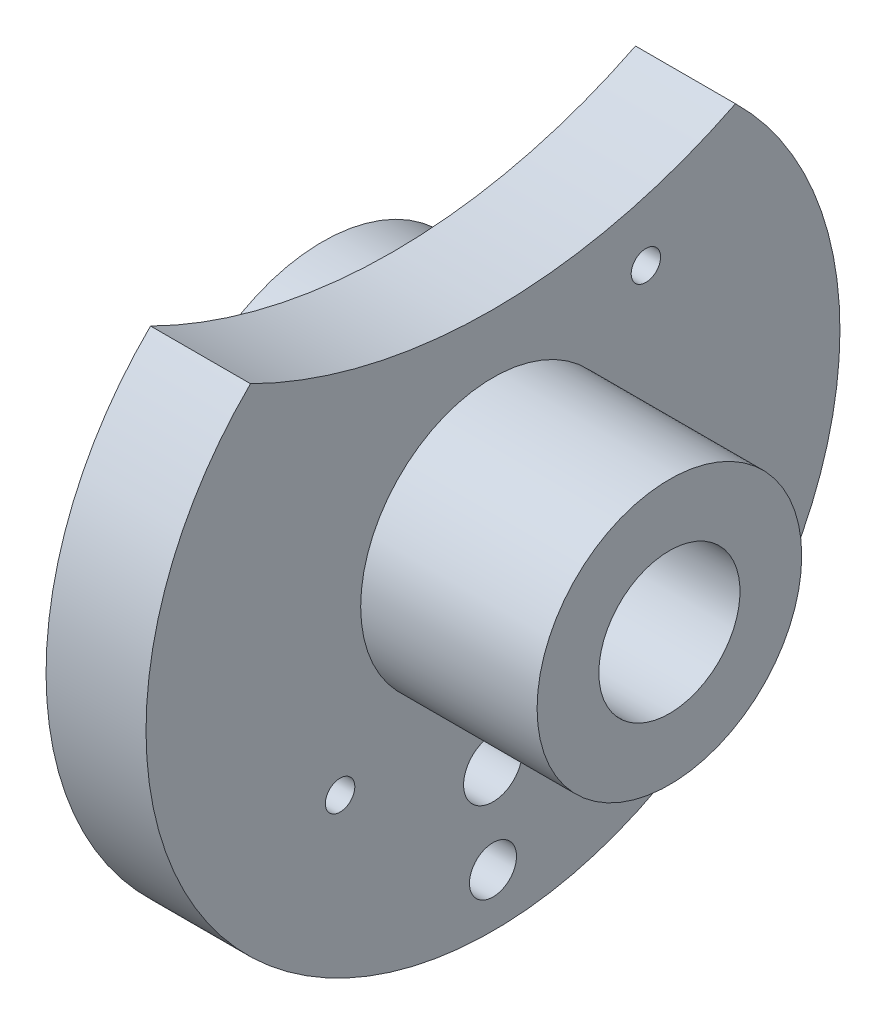
ISO-10303-21;
HEADER;
FILE_DESCRIPTION(('STEP AP214'),'2;1');
FILE_NAME('part.step','',(''),(''),'','','');
FILE_SCHEMA(('AUTOMOTIVE_DESIGN { 1 0 10303 214 1 1 1 1 }'));
ENDSEC;
DATA;
#1=APPLICATION_CONTEXT('core data for automotive mechanical design processes');
#2=APPLICATION_PROTOCOL_DEFINITION('international standard','automotive_design',2000,#1);
#3=PRODUCT_CONTEXT('',#1,'mechanical');
#4=PRODUCT('Part','Part','',(#3));
#5=PRODUCT_RELATED_PRODUCT_CATEGORY('part','',(#4));
#6=PRODUCT_DEFINITION_FORMATION('','',#4);
#7=PRODUCT_DEFINITION_CONTEXT('part definition',#1,'design');
#8=PRODUCT_DEFINITION('design','',#6,#7);
#9=PRODUCT_DEFINITION_SHAPE('','',#8);
#10=(LENGTH_UNIT() NAMED_UNIT(*) SI_UNIT(.MILLI.,.METRE.));
#11=(NAMED_UNIT(*) PLANE_ANGLE_UNIT() SI_UNIT($,.RADIAN.));
#12=(NAMED_UNIT(*) SI_UNIT($,.STERADIAN.) SOLID_ANGLE_UNIT());
#13=UNCERTAINTY_MEASURE_WITH_UNIT(LENGTH_MEASURE(1.E-05),#10,'distance_accuracy_value','');
#14=(GEOMETRIC_REPRESENTATION_CONTEXT(3) GLOBAL_UNCERTAINTY_ASSIGNED_CONTEXT((#13)) GLOBAL_UNIT_ASSIGNED_CONTEXT((#10,
#11,#12)) REPRESENTATION_CONTEXT('',''));
#15=CARTESIAN_POINT('',(0.,0.,0.));
#16=DIRECTION('',(0.,0.,1.));
#17=DIRECTION('',(1.,0.,0.));
#18=AXIS2_PLACEMENT_3D('',#15,#16,#17);
#19=CARTESIAN_POINT('',(-50.,0.,0.));
#20=DIRECTION('',(-1.,0.,0.));
#21=DIRECTION('',(0.,0.,1.));
#22=AXIS2_PLACEMENT_3D('',#19,#20,#21);
#23=CYLINDRICAL_SURFACE('',#22,24.);
#24=CARTESIAN_POINT('',(19.,0.,0.));
#25=DIRECTION('',(-1.,0.,0.));
#26=DIRECTION('',(0.,0.,1.));
#27=AXIS2_PLACEMENT_3D('',#24,#25,#26);
#28=CIRCLE('',#27,24.);
#29=CARTESIAN_POINT('',(19.,0.,24.));
#30=VERTEX_POINT('',#29);
#31=EDGE_CURVE('E64',#30,#30,#28,.T.);
#32=ORIENTED_EDGE('',*,*,#31,.F.);
#33=EDGE_LOOP('',(#32));
#34=FACE_BOUND('',#33,.T.);
#35=CARTESIAN_POINT('',(0.,0.,0.));
#36=DIRECTION('',(-1.,0.,0.));
#37=DIRECTION('',(0.,0.,1.));
#38=AXIS2_PLACEMENT_3D('',#35,#36,#37);
#39=CIRCLE('',#38,24.);
#40=CARTESIAN_POINT('',(0.,0.,24.));
#41=VERTEX_POINT('',#40);
#42=EDGE_CURVE('E41',#41,#41,#39,.T.);
#43=ORIENTED_EDGE('',*,*,#42,.T.);
#44=EDGE_LOOP('',(#43));
#45=FACE_BOUND('',#44,.T.);
#46=ADVANCED_FACE('F33',(#34,#45),#23,.F.);
#47=CARTESIAN_POINT('',(0.,24.,0.));
#48=DIRECTION('',(1.,0.,0.));
#49=DIRECTION('',(0.,0.,-1.));
#50=AXIS2_PLACEMENT_3D('',#47,#48,#49);
#51=PLANE('',#50);
#52=ORIENTED_EDGE('',*,*,#42,.F.);
#53=EDGE_LOOP('',(#52));
#54=FACE_BOUND('',#53,.T.);
#55=CARTESIAN_POINT('',(0.,0.,0.));
#56=DIRECTION('',(-1.,0.,0.));
#57=DIRECTION('',(0.,0.,1.));
#58=AXIS2_PLACEMENT_3D('',#55,#56,#57);
#59=CIRCLE('',#58,28.);
#60=CARTESIAN_POINT('',(0.,0.,28.));
#61=VERTEX_POINT('',#60);
#62=EDGE_CURVE('E77',#61,#61,#59,.T.);
#63=ORIENTED_EDGE('',*,*,#62,.T.);
#64=EDGE_LOOP('',(#63));
#65=FACE_BOUND('',#64,.T.);
#66=ADVANCED_FACE('F152',(#54,#65),#51,.F.);
#67=CARTESIAN_POINT('',(-50.,0.,0.));
#68=DIRECTION('',(-1.,0.,0.));
#69=DIRECTION('',(0.,0.,1.));
#70=AXIS2_PLACEMENT_3D('',#67,#68,#69);
#71=CYLINDRICAL_SURFACE('',#70,28.);
#72=ORIENTED_EDGE('',*,*,#62,.F.);
#73=EDGE_LOOP('',(#72));
#74=FACE_BOUND('',#73,.T.);
#75=CARTESIAN_POINT('',(12.,0.,0.));
#76=DIRECTION('',(-1.,0.,0.));
#77=DIRECTION('',(0.,0.,1.));
#78=AXIS2_PLACEMENT_3D('',#75,#76,#77);
#79=CIRCLE('',#78,28.);
#80=CARTESIAN_POINT('',(12.,0.,28.));
#81=VERTEX_POINT('',#80);
#82=EDGE_CURVE('E73',#81,#81,#79,.T.);
#83=ORIENTED_EDGE('',*,*,#82,.T.);
#84=EDGE_LOOP('',(#83));
#85=FACE_BOUND('',#84,.T.);
#86=ADVANCED_FACE('F157',(#74,#85),#71,.T.);
#87=CARTESIAN_POINT('',(12.,28.,0.));
#88=DIRECTION('',(1.,0.,0.));
#89=DIRECTION('',(0.,0.,-1.));
#90=AXIS2_PLACEMENT_3D('',#87,#88,#89);
#91=PLANE('',#90);
#92=CARTESIAN_POINT('',(12.,-26.,26.));
#93=DIRECTION('',(-1.,0.,0.));
#94=DIRECTION('',(0.,0.,1.));
#95=AXIS2_PLACEMENT_3D('',#92,#93,#94);
#96=CIRCLE('',#95,2.5);
#97=CARTESIAN_POINT('',(12.,-26.,28.5));
#98=VERTEX_POINT('',#97);
#99=EDGE_CURVE('E105',#98,#98,#96,.T.);
#100=ORIENTED_EDGE('',*,*,#99,.F.);
#101=EDGE_LOOP('',(#100));
#102=FACE_BOUND('',#101,.T.);
#103=CARTESIAN_POINT('',(12.,26.,-26.));
#104=DIRECTION('',(-1.,0.,0.));
#105=DIRECTION('',(0.,0.,1.));
#106=AXIS2_PLACEMENT_3D('',#103,#104,#105);
#107=CIRCLE('',#106,2.5);
#108=CARTESIAN_POINT('',(12.,26.,-23.5));
#109=VERTEX_POINT('',#108);
#110=EDGE_CURVE('E95',#109,#109,#107,.T.);
#111=ORIENTED_EDGE('',*,*,#110,.F.);
#112=EDGE_LOOP('',(#111));
#113=FACE_BOUND('',#112,.T.);
#114=CARTESIAN_POINT('',(12.,-50.,0.));
#115=DIRECTION('',(-1.,0.,0.));
#116=DIRECTION('',(0.,0.,1.));
#117=AXIS2_PLACEMENT_3D('',#114,#115,#116);
#118=CIRCLE('',#117,4.);
#119=CARTESIAN_POINT('',(12.,-50.,4.));
#120=VERTEX_POINT('',#119);
#121=EDGE_CURVE('E92',#120,#120,#118,.T.);
#122=ORIENTED_EDGE('',*,*,#121,.F.);
#123=EDGE_LOOP('',(#122));
#124=FACE_BOUND('',#123,.T.);
#125=CARTESIAN_POINT('',(12.,-35.,0.));
#126=DIRECTION('',(-1.,0.,0.));
#127=DIRECTION('',(0.,0.,1.));
#128=AXIS2_PLACEMENT_3D('',#125,#126,#127);
#129=CIRCLE('',#128,5.);
#130=CARTESIAN_POINT('',(12.,-35.,5.));
#131=VERTEX_POINT('',#130);
#132=EDGE_CURVE('E89',#131,#131,#129,.T.);
#133=ORIENTED_EDGE('',*,*,#132,.F.);
#134=EDGE_LOOP('',(#133));
#135=FACE_BOUND('',#134,.T.);
#136=ORIENTED_EDGE('',*,*,#82,.F.);
#137=EDGE_LOOP('',(#136));
#138=FACE_BOUND('',#137,.T.);
#139=CARTESIAN_POINT('',(12.,0.,0.));
#140=DIRECTION('',(-1.,0.,0.));
#141=DIRECTION('',(0.,0.,1.));
#142=AXIS2_PLACEMENT_3D('',#139,#140,#141);
#143=CIRCLE('',#142,59.);
#144=CARTESIAN_POINT('',(12.,42.199,-41.2340199228744));
#145=VERTEX_POINT('',#144);
#146=CARTESIAN_POINT('',(12.,42.199,41.2340199228744));
#147=VERTEX_POINT('',#146);
#148=EDGE_CURVE('E69',#145,#147,#143,.T.);
#149=ORIENTED_EDGE('',*,*,#148,.T.);
#150=CARTESIAN_POINT('',(12.,125.,0.));
#151=DIRECTION('',(-1.,0.,0.));
#152=DIRECTION('',(0.,0.,1.));
#153=AXIS2_PLACEMENT_3D('',#150,#151,#152);
#154=CIRCLE('',#153,92.5);
#155=EDGE_CURVE('E59',#145,#147,#154,.T.);
#156=ORIENTED_EDGE('',*,*,#155,.F.);
#157=EDGE_LOOP('',(#149,#156));
#158=FACE_BOUND('',#157,.T.);
#159=ADVANCED_FACE('F68',(#102,#113,#124,#135,#138,#158),#91,.F.);
#160=CARTESIAN_POINT('',(-50.,0.,0.));
#161=DIRECTION('',(-1.,0.,0.));
#162=DIRECTION('',(0.,0.,1.));
#163=AXIS2_PLACEMENT_3D('',#160,#161,#162);
#164=CYLINDRICAL_SURFACE('',#163,59.);
#165=ORIENTED_EDGE('',*,*,#148,.F.);
#166=DIRECTION('',(-1.,0.,0.));
#167=VECTOR('',#166,1.);
#168=CARTESIAN_POINT('',(35.5,42.199,-41.2340199228744));
#169=LINE('',#168,#167);
#170=CARTESIAN_POINT('',(29.,42.199,-41.2340199228744));
#171=VERTEX_POINT('',#170);
#172=EDGE_CURVE('E56',#145,#171,#169,.F.);
#173=ORIENTED_EDGE('',*,*,#172,.T.);
#174=CARTESIAN_POINT('',(29.,0.,0.));
#175=DIRECTION('',(-1.,0.,0.));
#176=DIRECTION('',(0.,0.,1.));
#177=AXIS2_PLACEMENT_3D('',#174,#175,#176);
#178=CIRCLE('',#177,59.);
#179=CARTESIAN_POINT('',(29.,42.199,41.2340199228744));
#180=VERTEX_POINT('',#179);
#181=EDGE_CURVE('E74',#171,#180,#178,.T.);
#182=ORIENTED_EDGE('',*,*,#181,.T.);
#183=DIRECTION('',(-1.,0.,0.));
#184=VECTOR('',#183,1.);
#185=CARTESIAN_POINT('',(35.5,42.199,41.2340199228744));
#186=LINE('',#185,#184);
#187=EDGE_CURVE('E49',#180,#147,#186,.T.);
#188=ORIENTED_EDGE('',*,*,#187,.T.);
#189=EDGE_LOOP('',(#165,#173,#182,#188));
#190=FACE_BOUND('',#189,.T.);
#191=ADVANCED_FACE('F72',(#190),#164,.T.);
#192=CARTESIAN_POINT('',(29.,59.,0.));
#193=DIRECTION('',(-1.,0.,0.));
#194=DIRECTION('',(0.,0.,1.));
#195=AXIS2_PLACEMENT_3D('',#192,#193,#194);
#196=PLANE('',#195);
#197=CARTESIAN_POINT('',(29.,-26.,26.));
#198=DIRECTION('',(-1.,0.,0.));
#199=DIRECTION('',(0.,0.,1.));
#200=AXIS2_PLACEMENT_3D('',#197,#198,#199);
#201=CIRCLE('',#200,2.5);
#202=CARTESIAN_POINT('',(29.,-26.,28.5));
#203=VERTEX_POINT('',#202);
#204=EDGE_CURVE('E36',#203,#203,#201,.T.);
#205=ORIENTED_EDGE('',*,*,#204,.T.);
#206=EDGE_LOOP('',(#205));
#207=FACE_BOUND('',#206,.T.);
#208=CARTESIAN_POINT('',(29.,26.,-26.));
#209=DIRECTION('',(-1.,0.,0.));
#210=DIRECTION('',(0.,0.,1.));
#211=AXIS2_PLACEMENT_3D('',#208,#209,#210);
#212=CIRCLE('',#211,2.5);
#213=CARTESIAN_POINT('',(29.,26.,-23.5));
#214=VERTEX_POINT('',#213);
#215=EDGE_CURVE('E93',#214,#214,#212,.T.);
#216=ORIENTED_EDGE('',*,*,#215,.T.);
#217=EDGE_LOOP('',(#216));
#218=FACE_BOUND('',#217,.T.);
#219=CARTESIAN_POINT('',(29.,-50.,0.));
#220=DIRECTION('',(-1.,0.,0.));
#221=DIRECTION('',(0.,0.,1.));
#222=AXIS2_PLACEMENT_3D('',#219,#220,#221);
#223=CIRCLE('',#222,4.);
#224=CARTESIAN_POINT('',(29.,-50.,4.));
#225=VERTEX_POINT('',#224);
#226=EDGE_CURVE('E90',#225,#225,#223,.T.);
#227=ORIENTED_EDGE('',*,*,#226,.T.);
#228=EDGE_LOOP('',(#227));
#229=FACE_BOUND('',#228,.T.);
#230=CARTESIAN_POINT('',(29.,-35.,0.));
#231=DIRECTION('',(-1.,0.,0.));
#232=DIRECTION('',(0.,0.,1.));
#233=AXIS2_PLACEMENT_3D('',#230,#231,#232);
#234=CIRCLE('',#233,5.);
#235=CARTESIAN_POINT('',(29.,-35.,5.));
#236=VERTEX_POINT('',#235);
#237=EDGE_CURVE('E70',#236,#236,#234,.T.);
#238=ORIENTED_EDGE('',*,*,#237,.T.);
#239=EDGE_LOOP('',(#238));
#240=FACE_BOUND('',#239,.T.);
#241=ORIENTED_EDGE('',*,*,#181,.F.);
#242=CARTESIAN_POINT('',(29.,125.,0.));
#243=DIRECTION('',(-1.,0.,0.));
#244=DIRECTION('',(0.,0.,1.));
#245=AXIS2_PLACEMENT_3D('',#242,#243,#244);
#246=CIRCLE('',#245,92.5);
#247=EDGE_CURVE('E11',#171,#180,#246,.T.);
#248=ORIENTED_EDGE('',*,*,#247,.T.);
#249=EDGE_LOOP('',(#241,#248));
#250=FACE_BOUND('',#249,.T.);
#251=CARTESIAN_POINT('',(29.,0.,0.));
#252=DIRECTION('',(-1.,0.,0.));
#253=DIRECTION('',(0.,0.,1.));
#254=AXIS2_PLACEMENT_3D('',#251,#252,#253);
#255=CIRCLE('',#254,22.5);
#256=CARTESIAN_POINT('',(29.,0.,22.5));
#257=VERTEX_POINT('',#256);
#258=EDGE_CURVE('E79',#257,#257,#255,.T.);
#259=ORIENTED_EDGE('',*,*,#258,.T.);
#260=EDGE_LOOP('',(#259));
#261=FACE_BOUND('',#260,.T.);
#262=ADVANCED_FACE('F124',(#207,#218,#229,#240,#250,#261),#196,.F.);
#263=CARTESIAN_POINT('',(-50.,0.,0.));
#264=DIRECTION('',(-1.,0.,0.));
#265=DIRECTION('',(0.,0.,1.));
#266=AXIS2_PLACEMENT_3D('',#263,#264,#265);
#267=CYLINDRICAL_SURFACE('',#266,22.5);
#268=ORIENTED_EDGE('',*,*,#258,.F.);
#269=EDGE_LOOP('',(#268));
#270=FACE_BOUND('',#269,.T.);
#271=CARTESIAN_POINT('',(59.,0.,0.));
#272=DIRECTION('',(-1.,0.,0.));
#273=DIRECTION('',(0.,0.,1.));
#274=AXIS2_PLACEMENT_3D('',#271,#272,#273);
#275=CIRCLE('',#274,22.5);
#276=CARTESIAN_POINT('',(59.,0.,22.5));
#277=VERTEX_POINT('',#276);
#278=EDGE_CURVE('E119',#277,#277,#275,.T.);
#279=ORIENTED_EDGE('',*,*,#278,.T.);
#280=EDGE_LOOP('',(#279));
#281=FACE_BOUND('',#280,.T.);
#282=ADVANCED_FACE('F126',(#270,#281),#267,.T.);
#283=CARTESIAN_POINT('',(59.,22.5,0.));
#284=DIRECTION('',(-1.,0.,0.));
#285=DIRECTION('',(0.,0.,1.));
#286=AXIS2_PLACEMENT_3D('',#283,#284,#285);
#287=PLANE('',#286);
#288=ORIENTED_EDGE('',*,*,#278,.F.);
#289=EDGE_LOOP('',(#288));
#290=FACE_BOUND('',#289,.T.);
#291=CARTESIAN_POINT('',(59.,0.,0.));
#292=DIRECTION('',(-1.,0.,0.));
#293=DIRECTION('',(0.,0.,1.));
#294=AXIS2_PLACEMENT_3D('',#291,#292,#293);
#295=CIRCLE('',#294,12.);
#296=CARTESIAN_POINT('',(59.,0.,12.));
#297=VERTEX_POINT('',#296);
#298=EDGE_CURVE('E116',#297,#297,#295,.T.);
#299=ORIENTED_EDGE('',*,*,#298,.T.);
#300=EDGE_LOOP('',(#299));
#301=FACE_BOUND('',#300,.T.);
#302=ADVANCED_FACE('F129',(#290,#301),#287,.F.);
#303=CARTESIAN_POINT('',(-50.,0.,0.));
#304=DIRECTION('',(-1.,0.,0.));
#305=DIRECTION('',(0.,0.,1.));
#306=AXIS2_PLACEMENT_3D('',#303,#304,#305);
#307=CYLINDRICAL_SURFACE('',#306,12.);
#308=ORIENTED_EDGE('',*,*,#298,.F.);
#309=EDGE_LOOP('',(#308));
#310=FACE_BOUND('',#309,.T.);
#311=CARTESIAN_POINT('',(19.,0.,0.));
#312=DIRECTION('',(-1.,0.,0.));
#313=DIRECTION('',(0.,0.,1.));
#314=AXIS2_PLACEMENT_3D('',#311,#312,#313);
#315=CIRCLE('',#314,12.);
#316=CARTESIAN_POINT('',(19.,0.,12.));
#317=VERTEX_POINT('',#316);
#318=EDGE_CURVE('E113',#317,#317,#315,.T.);
#319=ORIENTED_EDGE('',*,*,#318,.T.);
#320=EDGE_LOOP('',(#319));
#321=FACE_BOUND('',#320,.T.);
#322=ADVANCED_FACE('F135',(#310,#321),#307,.F.);
#323=CARTESIAN_POINT('',(19.,12.,0.));
#324=DIRECTION('',(1.,0.,0.));
#325=DIRECTION('',(0.,0.,-1.));
#326=AXIS2_PLACEMENT_3D('',#323,#324,#325);
#327=PLANE('',#326);
#328=ORIENTED_EDGE('',*,*,#318,.F.);
#329=EDGE_LOOP('',(#328));
#330=FACE_BOUND('',#329,.T.);
#331=ORIENTED_EDGE('',*,*,#31,.T.);
#332=EDGE_LOOP('',(#331));
#333=FACE_BOUND('',#332,.T.);
#334=ADVANCED_FACE('F141',(#330,#333),#327,.F.);
#335=CARTESIAN_POINT('',(59.,125.,0.));
#336=DIRECTION('',(-1.,0.,0.));
#337=DIRECTION('',(0.,0.,1.));
#338=AXIS2_PLACEMENT_3D('',#335,#336,#337);
#339=CYLINDRICAL_SURFACE('',#338,92.5);
#340=ORIENTED_EDGE('',*,*,#155,.T.);
#341=ORIENTED_EDGE('',*,*,#187,.F.);
#342=ORIENTED_EDGE('',*,*,#247,.F.);
#343=ORIENTED_EDGE('',*,*,#172,.F.);
#344=EDGE_LOOP('',(#340,#341,#342,#343));
#345=FACE_BOUND('',#344,.T.);
#346=ADVANCED_FACE('F58',(#345),#339,.F.);
#347=CARTESIAN_POINT('',(59.,-35.,0.));
#348=DIRECTION('',(-1.,0.,0.));
#349=DIRECTION('',(0.,0.,1.));
#350=AXIS2_PLACEMENT_3D('',#347,#348,#349);
#351=CYLINDRICAL_SURFACE('',#350,5.);
#352=ORIENTED_EDGE('',*,*,#132,.T.);
#353=EDGE_LOOP('',(#352));
#354=FACE_BOUND('',#353,.T.);
#355=ORIENTED_EDGE('',*,*,#237,.F.);
#356=EDGE_LOOP('',(#355));
#357=FACE_BOUND('',#356,.T.);
#358=ADVANCED_FACE('F180',(#354,#357),#351,.F.);
#359=CARTESIAN_POINT('',(59.,-50.,0.));
#360=DIRECTION('',(-1.,0.,0.));
#361=DIRECTION('',(0.,0.,1.));
#362=AXIS2_PLACEMENT_3D('',#359,#360,#361);
#363=CYLINDRICAL_SURFACE('',#362,4.);
#364=ORIENTED_EDGE('',*,*,#121,.T.);
#365=EDGE_LOOP('',(#364));
#366=FACE_BOUND('',#365,.T.);
#367=ORIENTED_EDGE('',*,*,#226,.F.);
#368=EDGE_LOOP('',(#367));
#369=FACE_BOUND('',#368,.T.);
#370=ADVANCED_FACE('F183',(#366,#369),#363,.F.);
#371=CARTESIAN_POINT('',(59.,26.,-26.));
#372=DIRECTION('',(-1.,0.,0.));
#373=DIRECTION('',(0.,0.,1.));
#374=AXIS2_PLACEMENT_3D('',#371,#372,#373);
#375=CYLINDRICAL_SURFACE('',#374,2.5);
#376=ORIENTED_EDGE('',*,*,#110,.T.);
#377=EDGE_LOOP('',(#376));
#378=FACE_BOUND('',#377,.T.);
#379=ORIENTED_EDGE('',*,*,#215,.F.);
#380=EDGE_LOOP('',(#379));
#381=FACE_BOUND('',#380,.T.);
#382=ADVANCED_FACE('F187',(#378,#381),#375,.F.);
#383=CARTESIAN_POINT('',(59.,-26.,26.));
#384=DIRECTION('',(-1.,0.,0.));
#385=DIRECTION('',(0.,0.,1.));
#386=AXIS2_PLACEMENT_3D('',#383,#384,#385);
#387=CYLINDRICAL_SURFACE('',#386,2.5);
#388=ORIENTED_EDGE('',*,*,#99,.T.);
#389=EDGE_LOOP('',(#388));
#390=FACE_BOUND('',#389,.T.);
#391=ORIENTED_EDGE('',*,*,#204,.F.);
#392=EDGE_LOOP('',(#391));
#393=FACE_BOUND('',#392,.T.);
#394=ADVANCED_FACE('F191',(#390,#393),#387,.F.);
#395=CLOSED_SHELL('',(#46,#66,#86,#159,#191,#262,#282,#302,#322,#334,#346,#358,#370,#382,#394));
#396=MANIFOLD_SOLID_BREP('B2',#395);
#397=ADVANCED_BREP_SHAPE_REPRESENTATION('',(#18,#396),#14);
#398=SHAPE_DEFINITION_REPRESENTATION(#9,#397);
ENDSEC;
END-ISO-10303-21;
